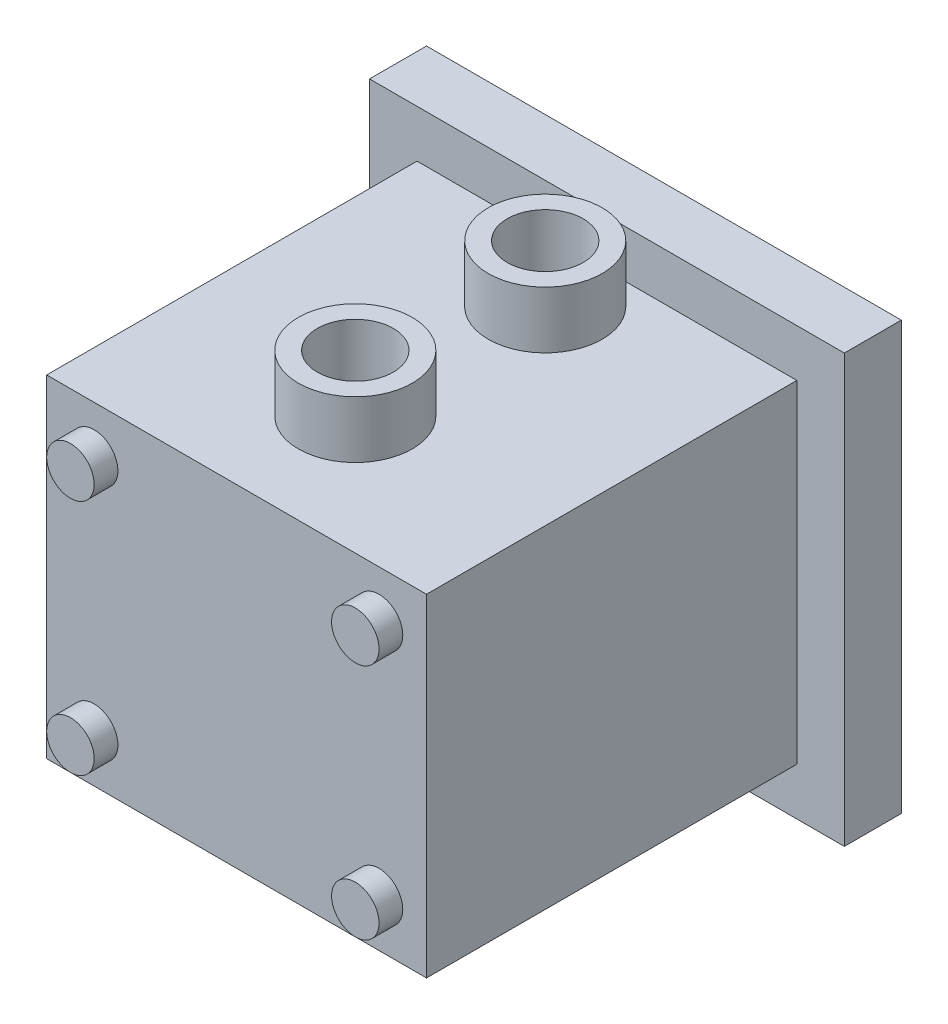
ISO-10303-21;
HEADER;
FILE_DESCRIPTION(('STEP AP214'),'2;1');
FILE_NAME('part.step','',(''),(''),'','','');
FILE_SCHEMA(('AUTOMOTIVE_DESIGN { 1 0 10303 214 1 1 1 1 }'));
ENDSEC;
DATA;
#1=APPLICATION_CONTEXT('core data for automotive mechanical design processes');
#2=APPLICATION_PROTOCOL_DEFINITION('international standard','automotive_design',2000,#1);
#3=PRODUCT_CONTEXT('',#1,'mechanical');
#4=PRODUCT('Part','Part','',(#3));
#5=PRODUCT_RELATED_PRODUCT_CATEGORY('part','',(#4));
#6=PRODUCT_DEFINITION_FORMATION('','',#4);
#7=PRODUCT_DEFINITION_CONTEXT('part definition',#1,'design');
#8=PRODUCT_DEFINITION('design','',#6,#7);
#9=PRODUCT_DEFINITION_SHAPE('','',#8);
#10=(LENGTH_UNIT() NAMED_UNIT(*) SI_UNIT(.MILLI.,.METRE.));
#11=(NAMED_UNIT(*) PLANE_ANGLE_UNIT() SI_UNIT($,.RADIAN.));
#12=(NAMED_UNIT(*) SI_UNIT($,.STERADIAN.) SOLID_ANGLE_UNIT());
#13=UNCERTAINTY_MEASURE_WITH_UNIT(LENGTH_MEASURE(1.E-05),#10,'distance_accuracy_value','');
#14=(GEOMETRIC_REPRESENTATION_CONTEXT(3) GLOBAL_UNCERTAINTY_ASSIGNED_CONTEXT((#13)) GLOBAL_UNIT_ASSIGNED_CONTEXT((#10,
#11,#12)) REPRESENTATION_CONTEXT('',''));
#15=CARTESIAN_POINT('',(0.,0.,0.));
#16=DIRECTION('',(0.,0.,1.));
#17=DIRECTION('',(1.,0.,0.));
#18=AXIS2_PLACEMENT_3D('',#15,#16,#17);
#19=CARTESIAN_POINT('',(0.,47.,65.));
#20=DIRECTION('',(0.,1.,0.));
#21=DIRECTION('',(0.,0.,1.));
#22=AXIS2_PLACEMENT_3D('',#19,#20,#21);
#23=PLANE('',#22);
#24=CARTESIAN_POINT('',(0.,47.,65.));
#25=DIRECTION('',(0.,1.,0.));
#26=DIRECTION('',(0.,0.,1.));
#27=AXIS2_PLACEMENT_3D('',#24,#25,#26);
#28=CIRCLE('',#27,12.);
#29=CARTESIAN_POINT('',(0.,47.,77.));
#30=VERTEX_POINT('',#29);
#31=EDGE_CURVE('E11',#30,#30,#28,.T.);
#32=ORIENTED_EDGE('',*,*,#31,.T.);
#33=EDGE_LOOP('',(#32));
#34=FACE_BOUND('',#33,.T.);
#35=CARTESIAN_POINT('',(0.,47.,65.));
#36=DIRECTION('',(0.,1.,0.));
#37=DIRECTION('',(0.,0.,1.));
#38=AXIS2_PLACEMENT_3D('',#35,#36,#37);
#39=CIRCLE('',#38,8.);
#40=CARTESIAN_POINT('',(0.,47.,73.));
#41=VERTEX_POINT('',#40);
#42=EDGE_CURVE('E67',#41,#41,#39,.T.);
#43=ORIENTED_EDGE('',*,*,#42,.F.);
#44=EDGE_LOOP('',(#43));
#45=FACE_BOUND('',#44,.T.);
#46=ADVANCED_FACE('F53',(#34,#45),#23,.T.);
#47=CARTESIAN_POINT('',(0.,35.,65.));
#48=DIRECTION('',(0.,1.,0.));
#49=DIRECTION('',(0.,0.,1.));
#50=AXIS2_PLACEMENT_3D('',#47,#48,#49);
#51=PLANE('',#50);
#52=CARTESIAN_POINT('',(0.,35.,65.));
#53=DIRECTION('',(0.,1.,0.));
#54=DIRECTION('',(0.,0.,1.));
#55=AXIS2_PLACEMENT_3D('',#52,#53,#54);
#56=CIRCLE('',#55,12.);
#57=CARTESIAN_POINT('',(0.,35.,77.));
#58=VERTEX_POINT('',#57);
#59=EDGE_CURVE('E59',#58,#58,#56,.T.);
#60=ORIENTED_EDGE('',*,*,#59,.F.);
#61=EDGE_LOOP('',(#60));
#62=FACE_BOUND('',#61,.T.);
#63=CARTESIAN_POINT('',(0.,35.,65.));
#64=DIRECTION('',(0.,1.,0.));
#65=DIRECTION('',(0.,0.,1.));
#66=AXIS2_PLACEMENT_3D('',#63,#64,#65);
#67=CIRCLE('',#66,8.);
#68=CARTESIAN_POINT('',(0.,35.,73.));
#69=VERTEX_POINT('',#68);
#70=EDGE_CURVE('E69',#69,#69,#67,.T.);
#71=ORIENTED_EDGE('',*,*,#70,.T.);
#72=EDGE_LOOP('',(#71));
#73=FACE_BOUND('',#72,.T.);
#74=ADVANCED_FACE('F84',(#62,#73),#51,.F.);
#75=CARTESIAN_POINT('',(0.,47.,65.));
#76=DIRECTION('',(0.,-1.,0.));
#77=DIRECTION('',(0.,0.,-1.));
#78=AXIS2_PLACEMENT_3D('',#75,#76,#77);
#79=CYLINDRICAL_SURFACE('',#78,12.);
#80=ORIENTED_EDGE('',*,*,#31,.F.);
#81=EDGE_LOOP('',(#80));
#82=FACE_BOUND('',#81,.T.);
#83=ORIENTED_EDGE('',*,*,#59,.T.);
#84=EDGE_LOOP('',(#83));
#85=FACE_BOUND('',#84,.T.);
#86=ADVANCED_FACE('F57',(#82,#85),#79,.T.);
#87=CARTESIAN_POINT('',(0.,47.,65.));
#88=DIRECTION('',(0.,-1.,0.));
#89=DIRECTION('',(0.,0.,-1.));
#90=AXIS2_PLACEMENT_3D('',#87,#88,#89);
#91=CYLINDRICAL_SURFACE('',#90,8.);
#92=ORIENTED_EDGE('',*,*,#42,.T.);
#93=EDGE_LOOP('',(#92));
#94=FACE_BOUND('',#93,.T.);
#95=ORIENTED_EDGE('',*,*,#70,.F.);
#96=EDGE_LOOP('',(#95));
#97=FACE_BOUND('',#96,.T.);
#98=ADVANCED_FACE('F80',(#94,#97),#91,.F.);
#99=CLOSED_SHELL('',(#46,#74,#86,#98));
#100=MANIFOLD_SOLID_BREP('B2',#99);
#101=CARTESIAN_POINT('',(0.,47.,25.));
#102=DIRECTION('',(0.,1.,0.));
#103=DIRECTION('',(0.,0.,1.));
#104=AXIS2_PLACEMENT_3D('',#101,#102,#103);
#105=PLANE('',#104);
#106=CARTESIAN_POINT('',(0.,47.,25.));
#107=DIRECTION('',(0.,1.,0.));
#108=DIRECTION('',(0.,0.,1.));
#109=AXIS2_PLACEMENT_3D('',#106,#107,#108);
#110=CIRCLE('',#109,12.);
#111=CARTESIAN_POINT('',(0.,47.,37.));
#112=VERTEX_POINT('',#111);
#113=EDGE_CURVE('E52',#112,#112,#110,.T.);
#114=ORIENTED_EDGE('',*,*,#113,.T.);
#115=EDGE_LOOP('',(#114));
#116=FACE_BOUND('',#115,.T.);
#117=CARTESIAN_POINT('',(0.,47.,25.));
#118=DIRECTION('',(0.,1.,0.));
#119=DIRECTION('',(0.,0.,1.));
#120=AXIS2_PLACEMENT_3D('',#117,#118,#119);
#121=CIRCLE('',#120,8.);
#122=CARTESIAN_POINT('',(0.,47.,33.));
#123=VERTEX_POINT('',#122);
#124=EDGE_CURVE('E149',#123,#123,#121,.T.);
#125=ORIENTED_EDGE('',*,*,#124,.F.);
#126=EDGE_LOOP('',(#125));
#127=FACE_BOUND('',#126,.T.);
#128=ADVANCED_FACE('F135',(#116,#127),#105,.T.);
#129=CARTESIAN_POINT('',(0.,35.,25.));
#130=DIRECTION('',(0.,1.,0.));
#131=DIRECTION('',(0.,0.,1.));
#132=AXIS2_PLACEMENT_3D('',#129,#130,#131);
#133=PLANE('',#132);
#134=CARTESIAN_POINT('',(0.,35.,25.));
#135=DIRECTION('',(0.,1.,0.));
#136=DIRECTION('',(0.,0.,1.));
#137=AXIS2_PLACEMENT_3D('',#134,#135,#136);
#138=CIRCLE('',#137,12.);
#139=CARTESIAN_POINT('',(0.,35.,37.));
#140=VERTEX_POINT('',#139);
#141=EDGE_CURVE('E137',#140,#140,#138,.T.);
#142=ORIENTED_EDGE('',*,*,#141,.F.);
#143=EDGE_LOOP('',(#142));
#144=FACE_BOUND('',#143,.T.);
#145=CARTESIAN_POINT('',(0.,35.,25.));
#146=DIRECTION('',(0.,1.,0.));
#147=DIRECTION('',(0.,0.,1.));
#148=AXIS2_PLACEMENT_3D('',#145,#146,#147);
#149=CIRCLE('',#148,8.);
#150=CARTESIAN_POINT('',(0.,35.,33.));
#151=VERTEX_POINT('',#150);
#152=EDGE_CURVE('E150',#151,#151,#149,.T.);
#153=ORIENTED_EDGE('',*,*,#152,.T.);
#154=EDGE_LOOP('',(#153));
#155=FACE_BOUND('',#154,.T.);
#156=ADVANCED_FACE('F156',(#144,#155),#133,.F.);
#157=CARTESIAN_POINT('',(0.,47.,25.));
#158=DIRECTION('',(0.,-1.,0.));
#159=DIRECTION('',(0.,0.,-1.));
#160=AXIS2_PLACEMENT_3D('',#157,#158,#159);
#161=CYLINDRICAL_SURFACE('',#160,12.);
#162=ORIENTED_EDGE('',*,*,#113,.F.);
#163=EDGE_LOOP('',(#162));
#164=FACE_BOUND('',#163,.T.);
#165=ORIENTED_EDGE('',*,*,#141,.T.);
#166=EDGE_LOOP('',(#165));
#167=FACE_BOUND('',#166,.T.);
#168=ADVANCED_FACE('F133',(#164,#167),#161,.T.);
#169=CARTESIAN_POINT('',(0.,47.,25.));
#170=DIRECTION('',(0.,-1.,0.));
#171=DIRECTION('',(0.,0.,-1.));
#172=AXIS2_PLACEMENT_3D('',#169,#170,#171);
#173=CYLINDRICAL_SURFACE('',#172,8.);
#174=ORIENTED_EDGE('',*,*,#124,.T.);
#175=EDGE_LOOP('',(#174));
#176=FACE_BOUND('',#175,.T.);
#177=ORIENTED_EDGE('',*,*,#152,.F.);
#178=EDGE_LOOP('',(#177));
#179=FACE_BOUND('',#178,.T.);
#180=ADVANCED_FACE('F154',(#176,#179),#173,.F.);
#181=CLOSED_SHELL('',(#128,#156,#168,#180));
#182=MANIFOLD_SOLID_BREP('B6',#181);
#183=CARTESIAN_POINT('',(30.,25.,95.));
#184=DIRECTION('',(0.,0.,-1.));
#185=DIRECTION('',(-1.,0.,0.));
#186=AXIS2_PLACEMENT_3D('',#183,#184,#185);
#187=CYLINDRICAL_SURFACE('',#186,5.);
#188=CARTESIAN_POINT('',(30.,25.,95.));
#189=DIRECTION('',(0.,0.,1.));
#190=DIRECTION('',(1.,0.,0.));
#191=AXIS2_PLACEMENT_3D('',#188,#189,#190);
#192=CIRCLE('',#191,5.);
#193=CARTESIAN_POINT('',(35.,25.,95.));
#194=VERTEX_POINT('',#193);
#195=EDGE_CURVE('E131',#194,#194,#192,.T.);
#196=ORIENTED_EDGE('',*,*,#195,.F.);
#197=EDGE_LOOP('',(#196));
#198=FACE_BOUND('',#197,.T.);
#199=CARTESIAN_POINT('',(30.,25.,90.));
#200=DIRECTION('',(0.,0.,1.));
#201=DIRECTION('',(1.,0.,0.));
#202=AXIS2_PLACEMENT_3D('',#199,#200,#201);
#203=CIRCLE('',#202,5.);
#204=CARTESIAN_POINT('',(35.,25.,90.));
#205=VERTEX_POINT('',#204);
#206=EDGE_CURVE('E215',#205,#205,#203,.T.);
#207=ORIENTED_EDGE('',*,*,#206,.T.);
#208=EDGE_LOOP('',(#207));
#209=FACE_BOUND('',#208,.T.);
#210=ADVANCED_FACE('F208',(#198,#209),#187,.T.);
#211=CARTESIAN_POINT('',(30.,25.,95.));
#212=DIRECTION('',(0.,0.,1.));
#213=DIRECTION('',(1.,0.,0.));
#214=AXIS2_PLACEMENT_3D('',#211,#212,#213);
#215=PLANE('',#214);
#216=ORIENTED_EDGE('',*,*,#195,.T.);
#217=EDGE_LOOP('',(#216));
#218=FACE_BOUND('',#217,.T.);
#219=ADVANCED_FACE('F227',(#218),#215,.T.);
#220=CARTESIAN_POINT('',(30.,25.,90.));
#221=DIRECTION('',(0.,0.,1.));
#222=DIRECTION('',(1.,0.,0.));
#223=AXIS2_PLACEMENT_3D('',#220,#221,#222);
#224=PLANE('',#223);
#225=ORIENTED_EDGE('',*,*,#206,.F.);
#226=EDGE_LOOP('',(#225));
#227=FACE_BOUND('',#226,.T.);
#228=ADVANCED_FACE('F223',(#227),#224,.F.);
#229=CLOSED_SHELL('',(#210,#219,#228));
#230=MANIFOLD_SOLID_BREP('B48',#229);
#231=CARTESIAN_POINT('',(30.,-25.,95.));
#232=DIRECTION('',(0.,0.,-1.));
#233=DIRECTION('',(-1.,0.,0.));
#234=AXIS2_PLACEMENT_3D('',#231,#232,#233);
#235=CYLINDRICAL_SURFACE('',#234,5.);
#236=CARTESIAN_POINT('',(30.,-25.,95.));
#237=DIRECTION('',(0.,0.,1.));
#238=DIRECTION('',(1.,0.,0.));
#239=AXIS2_PLACEMENT_3D('',#236,#237,#238);
#240=CIRCLE('',#239,5.);
#241=CARTESIAN_POINT('',(35.,-25.,95.));
#242=VERTEX_POINT('',#241);
#243=EDGE_CURVE('E209',#242,#242,#240,.T.);
#244=ORIENTED_EDGE('',*,*,#243,.F.);
#245=EDGE_LOOP('',(#244));
#246=FACE_BOUND('',#245,.T.);
#247=CARTESIAN_POINT('',(30.,-25.,90.));
#248=DIRECTION('',(0.,0.,1.));
#249=DIRECTION('',(1.,0.,0.));
#250=AXIS2_PLACEMENT_3D('',#247,#248,#249);
#251=CIRCLE('',#250,5.);
#252=CARTESIAN_POINT('',(35.,-25.,90.));
#253=VERTEX_POINT('',#252);
#254=EDGE_CURVE('E269',#253,#253,#251,.T.);
#255=ORIENTED_EDGE('',*,*,#254,.T.);
#256=EDGE_LOOP('',(#255));
#257=FACE_BOUND('',#256,.T.);
#258=ADVANCED_FACE('F263',(#246,#257),#235,.T.);
#259=CARTESIAN_POINT('',(30.,-25.,95.));
#260=DIRECTION('',(0.,0.,1.));
#261=DIRECTION('',(1.,0.,0.));
#262=AXIS2_PLACEMENT_3D('',#259,#260,#261);
#263=PLANE('',#262);
#264=ORIENTED_EDGE('',*,*,#243,.T.);
#265=EDGE_LOOP('',(#264));
#266=FACE_BOUND('',#265,.T.);
#267=ADVANCED_FACE('F281',(#266),#263,.T.);
#268=CARTESIAN_POINT('',(30.,-25.,90.));
#269=DIRECTION('',(0.,0.,1.));
#270=DIRECTION('',(1.,0.,0.));
#271=AXIS2_PLACEMENT_3D('',#268,#269,#270);
#272=PLANE('',#271);
#273=ORIENTED_EDGE('',*,*,#254,.F.);
#274=EDGE_LOOP('',(#273));
#275=FACE_BOUND('',#274,.T.);
#276=ADVANCED_FACE('F278',(#275),#272,.F.);
#277=CLOSED_SHELL('',(#258,#267,#276));
#278=MANIFOLD_SOLID_BREP('B129',#277);
#279=CARTESIAN_POINT('',(-30.,25.,95.));
#280=DIRECTION('',(0.,0.,-1.));
#281=DIRECTION('',(-1.,0.,0.));
#282=AXIS2_PLACEMENT_3D('',#279,#280,#281);
#283=CYLINDRICAL_SURFACE('',#282,5.);
#284=CARTESIAN_POINT('',(-30.,25.,95.));
#285=DIRECTION('',(0.,0.,1.));
#286=DIRECTION('',(1.,0.,0.));
#287=AXIS2_PLACEMENT_3D('',#284,#285,#286);
#288=CIRCLE('',#287,5.);
#289=CARTESIAN_POINT('',(-25.,25.,95.));
#290=VERTEX_POINT('',#289);
#291=EDGE_CURVE('E262',#290,#290,#288,.T.);
#292=ORIENTED_EDGE('',*,*,#291,.F.);
#293=EDGE_LOOP('',(#292));
#294=FACE_BOUND('',#293,.T.);
#295=CARTESIAN_POINT('',(-30.,25.,90.));
#296=DIRECTION('',(0.,0.,1.));
#297=DIRECTION('',(1.,0.,0.));
#298=AXIS2_PLACEMENT_3D('',#295,#296,#297);
#299=CIRCLE('',#298,5.);
#300=CARTESIAN_POINT('',(-25.,25.,90.));
#301=VERTEX_POINT('',#300);
#302=EDGE_CURVE('E324',#301,#301,#299,.T.);
#303=ORIENTED_EDGE('',*,*,#302,.T.);
#304=EDGE_LOOP('',(#303));
#305=FACE_BOUND('',#304,.T.);
#306=ADVANCED_FACE('F319',(#294,#305),#283,.T.);
#307=CARTESIAN_POINT('',(-30.,25.,95.));
#308=DIRECTION('',(0.,0.,1.));
#309=DIRECTION('',(1.,0.,0.));
#310=AXIS2_PLACEMENT_3D('',#307,#308,#309);
#311=PLANE('',#310);
#312=ORIENTED_EDGE('',*,*,#291,.T.);
#313=EDGE_LOOP('',(#312));
#314=FACE_BOUND('',#313,.T.);
#315=ADVANCED_FACE('F333',(#314),#311,.T.);
#316=CARTESIAN_POINT('',(-30.,25.,90.));
#317=DIRECTION('',(0.,0.,1.));
#318=DIRECTION('',(1.,0.,0.));
#319=AXIS2_PLACEMENT_3D('',#316,#317,#318);
#320=PLANE('',#319);
#321=ORIENTED_EDGE('',*,*,#302,.F.);
#322=EDGE_LOOP('',(#321));
#323=FACE_BOUND('',#322,.T.);
#324=ADVANCED_FACE('F335',(#323),#320,.F.);
#325=CLOSED_SHELL('',(#306,#315,#324));
#326=MANIFOLD_SOLID_BREP('B201',#325);
#327=CARTESIAN_POINT('',(-30.,-25.,95.));
#328=DIRECTION('',(0.,0.,-1.));
#329=DIRECTION('',(-1.,0.,0.));
#330=AXIS2_PLACEMENT_3D('',#327,#328,#329);
#331=CYLINDRICAL_SURFACE('',#330,5.);
#332=CARTESIAN_POINT('',(-30.,-25.,95.));
#333=DIRECTION('',(0.,0.,1.));
#334=DIRECTION('',(1.,0.,0.));
#335=AXIS2_PLACEMENT_3D('',#332,#333,#334);
#336=CIRCLE('',#335,5.);
#337=CARTESIAN_POINT('',(-25.,-25.,95.));
#338=VERTEX_POINT('',#337);
#339=EDGE_CURVE('E320',#338,#338,#336,.T.);
#340=ORIENTED_EDGE('',*,*,#339,.F.);
#341=EDGE_LOOP('',(#340));
#342=FACE_BOUND('',#341,.T.);
#343=CARTESIAN_POINT('',(-30.,-25.,90.));
#344=DIRECTION('',(0.,0.,1.));
#345=DIRECTION('',(1.,0.,0.));
#346=AXIS2_PLACEMENT_3D('',#343,#344,#345);
#347=CIRCLE('',#346,5.);
#348=CARTESIAN_POINT('',(-25.,-25.,90.));
#349=VERTEX_POINT('',#348);
#350=EDGE_CURVE('E374',#349,#349,#347,.T.);
#351=ORIENTED_EDGE('',*,*,#350,.T.);
#352=EDGE_LOOP('',(#351));
#353=FACE_BOUND('',#352,.T.);
#354=ADVANCED_FACE('F375',(#342,#353),#331,.T.);
#355=CARTESIAN_POINT('',(-30.,-25.,95.));
#356=DIRECTION('',(0.,0.,1.));
#357=DIRECTION('',(1.,0.,0.));
#358=AXIS2_PLACEMENT_3D('',#355,#356,#357);
#359=PLANE('',#358);
#360=ORIENTED_EDGE('',*,*,#339,.T.);
#361=EDGE_LOOP('',(#360));
#362=FACE_BOUND('',#361,.T.);
#363=ADVANCED_FACE('F388',(#362),#359,.T.);
#364=CARTESIAN_POINT('',(-30.,-25.,90.));
#365=DIRECTION('',(0.,0.,1.));
#366=DIRECTION('',(1.,0.,0.));
#367=AXIS2_PLACEMENT_3D('',#364,#365,#366);
#368=PLANE('',#367);
#369=ORIENTED_EDGE('',*,*,#350,.F.);
#370=EDGE_LOOP('',(#369));
#371=FACE_BOUND('',#370,.T.);
#372=ADVANCED_FACE('F386',(#371),#368,.F.);
#373=CLOSED_SHELL('',(#354,#363,#372));
#374=MANIFOLD_SOLID_BREP('B260',#373);
#375=CARTESIAN_POINT('',(0.,0.,-30.));
#376=DIRECTION('',(0.,0.,1.));
#377=DIRECTION('',(1.,0.,0.));
#378=AXIS2_PLACEMENT_3D('',#375,#376,#377);
#379=CYLINDRICAL_SURFACE('',#378,9.525);
#380=CARTESIAN_POINT('',(0.,0.,-30.));
#381=DIRECTION('',(0.,0.,1.));
#382=DIRECTION('',(1.,0.,0.));
#383=AXIS2_PLACEMENT_3D('',#380,#381,#382);
#384=CIRCLE('',#383,9.525);
#385=CARTESIAN_POINT('',(9.525,0.,-30.));
#386=VERTEX_POINT('',#385);
#387=EDGE_CURVE('E371',#386,#386,#384,.T.);
#388=ORIENTED_EDGE('',*,*,#387,.T.);
#389=EDGE_LOOP('',(#388));
#390=FACE_BOUND('',#389,.T.);
#391=CARTESIAN_POINT('',(0.,0.,0.));
#392=DIRECTION('',(0.,0.,1.));
#393=DIRECTION('',(1.,0.,0.));
#394=AXIS2_PLACEMENT_3D('',#391,#392,#393);
#395=CIRCLE('',#394,9.525);
#396=CARTESIAN_POINT('',(9.525,0.,0.));
#397=VERTEX_POINT('',#396);
#398=EDGE_CURVE('E431',#397,#397,#395,.T.);
#399=ORIENTED_EDGE('',*,*,#398,.F.);
#400=EDGE_LOOP('',(#399));
#401=FACE_BOUND('',#400,.T.);
#402=ADVANCED_FACE('F426',(#390,#401),#379,.T.);
#403=CARTESIAN_POINT('',(0.,0.,-30.));
#404=DIRECTION('',(0.,0.,1.));
#405=DIRECTION('',(1.,0.,0.));
#406=AXIS2_PLACEMENT_3D('',#403,#404,#405);
#407=PLANE('',#406);
#408=ORIENTED_EDGE('',*,*,#387,.F.);
#409=EDGE_LOOP('',(#408));
#410=FACE_BOUND('',#409,.T.);
#411=ADVANCED_FACE('F444',(#410),#407,.F.);
#412=CARTESIAN_POINT('',(0.,0.,0.));
#413=DIRECTION('',(0.,0.,1.));
#414=DIRECTION('',(1.,0.,0.));
#415=AXIS2_PLACEMENT_3D('',#412,#413,#414);
#416=PLANE('',#415);
#417=ORIENTED_EDGE('',*,*,#398,.T.);
#418=EDGE_LOOP('',(#417));
#419=FACE_BOUND('',#418,.T.);
#420=ADVANCED_FACE('F445',(#419),#416,.T.);
#421=CLOSED_SHELL('',(#402,#411,#420));
#422=MANIFOLD_SOLID_BREP('B315',#421);
#423=CARTESIAN_POINT('',(-50.,-45.,12.));
#424=DIRECTION('',(1.,0.,0.));
#425=DIRECTION('',(0.,0.,-1.));
#426=AXIS2_PLACEMENT_3D('',#423,#424,#425);
#427=PLANE('',#426);
#428=DIRECTION('',(0.,-1.,0.));
#429=VECTOR('',#428,1.);
#430=CARTESIAN_POINT('',(-50.,-45.,0.));
#431=LINE('',#430,#429);
#432=CARTESIAN_POINT('',(-50.,45.,0.));
#433=VERTEX_POINT('',#432);
#434=CARTESIAN_POINT('',(-50.,-45.,0.));
#435=VERTEX_POINT('',#434);
#436=EDGE_CURVE('E552',#433,#435,#431,.T.);
#437=ORIENTED_EDGE('',*,*,#436,.T.);
#438=DIRECTION('',(0.,0.,-1.));
#439=VECTOR('',#438,1.);
#440=CARTESIAN_POINT('',(-50.,-45.,12.));
#441=LINE('',#440,#439);
#442=CARTESIAN_POINT('',(-50.,-45.,12.));
#443=VERTEX_POINT('',#442);
#444=EDGE_CURVE('E428',#443,#435,#441,.T.);
#445=ORIENTED_EDGE('',*,*,#444,.F.);
#446=DIRECTION('',(0.,-1.,0.));
#447=VECTOR('',#446,1.);
#448=CARTESIAN_POINT('',(-50.,-45.,12.));
#449=LINE('',#448,#447);
#450=CARTESIAN_POINT('',(-50.,45.,12.));
#451=VERTEX_POINT('',#450);
#452=EDGE_CURVE('E533',#451,#443,#449,.T.);
#453=ORIENTED_EDGE('',*,*,#452,.F.);
#454=DIRECTION('',(0.,0.,-1.));
#455=VECTOR('',#454,1.);
#456=CARTESIAN_POINT('',(-50.,45.,12.));
#457=LINE('',#456,#455);
#458=EDGE_CURVE('E550',#451,#433,#457,.T.);
#459=ORIENTED_EDGE('',*,*,#458,.T.);
#460=EDGE_LOOP('',(#437,#445,#453,#459));
#461=FACE_BOUND('',#460,.T.);
#462=ADVANCED_FACE('F485',(#461),#427,.F.);
#463=CARTESIAN_POINT('',(-50.,-45.,12.));
#464=DIRECTION('',(0.,1.,0.));
#465=DIRECTION('',(0.,0.,1.));
#466=AXIS2_PLACEMENT_3D('',#463,#464,#465);
#467=PLANE('',#466);
#468=DIRECTION('',(1.,0.,0.));
#469=VECTOR('',#468,1.);
#470=CARTESIAN_POINT('',(-50.,-45.,0.));
#471=LINE('',#470,#469);
#472=CARTESIAN_POINT('',(50.,-45.,0.));
#473=VERTEX_POINT('',#472);
#474=EDGE_CURVE('E537',#435,#473,#471,.T.);
#475=ORIENTED_EDGE('',*,*,#474,.T.);
#476=DIRECTION('',(0.,0.,-1.));
#477=VECTOR('',#476,1.);
#478=CARTESIAN_POINT('',(50.,-45.,12.));
#479=LINE('',#478,#477);
#480=CARTESIAN_POINT('',(50.,-45.,12.));
#481=VERTEX_POINT('',#480);
#482=EDGE_CURVE('E495',#481,#473,#479,.T.);
#483=ORIENTED_EDGE('',*,*,#482,.F.);
#484=DIRECTION('',(1.,0.,0.));
#485=VECTOR('',#484,1.);
#486=CARTESIAN_POINT('',(-50.,-45.,12.));
#487=LINE('',#486,#485);
#488=EDGE_CURVE('E528',#443,#481,#487,.T.);
#489=ORIENTED_EDGE('',*,*,#488,.F.);
#490=ORIENTED_EDGE('',*,*,#444,.T.);
#491=EDGE_LOOP('',(#475,#483,#489,#490));
#492=FACE_BOUND('',#491,.T.);
#493=ADVANCED_FACE('F538',(#492),#467,.F.);
#494=CARTESIAN_POINT('',(50.,-45.,12.));
#495=DIRECTION('',(-1.,0.,0.));
#496=DIRECTION('',(0.,0.,1.));
#497=AXIS2_PLACEMENT_3D('',#494,#495,#496);
#498=PLANE('',#497);
#499=DIRECTION('',(0.,1.,0.));
#500=VECTOR('',#499,1.);
#501=CARTESIAN_POINT('',(50.,-45.,0.));
#502=LINE('',#501,#500);
#503=CARTESIAN_POINT('',(50.,45.,0.));
#504=VERTEX_POINT('',#503);
#505=EDGE_CURVE('E516',#473,#504,#502,.T.);
#506=ORIENTED_EDGE('',*,*,#505,.T.);
#507=DIRECTION('',(0.,0.,-1.));
#508=VECTOR('',#507,1.);
#509=CARTESIAN_POINT('',(50.,45.,12.));
#510=LINE('',#509,#508);
#511=CARTESIAN_POINT('',(50.,45.,12.));
#512=VERTEX_POINT('',#511);
#513=EDGE_CURVE('E545',#512,#504,#510,.T.);
#514=ORIENTED_EDGE('',*,*,#513,.F.);
#515=DIRECTION('',(0.,1.,0.));
#516=VECTOR('',#515,1.);
#517=CARTESIAN_POINT('',(50.,-45.,12.));
#518=LINE('',#517,#516);
#519=EDGE_CURVE('E531',#481,#512,#518,.T.);
#520=ORIENTED_EDGE('',*,*,#519,.F.);
#521=ORIENTED_EDGE('',*,*,#482,.T.);
#522=EDGE_LOOP('',(#506,#514,#520,#521));
#523=FACE_BOUND('',#522,.T.);
#524=ADVANCED_FACE('F542',(#523),#498,.F.);
#525=CARTESIAN_POINT('',(-50.,45.,12.));
#526=DIRECTION('',(0.,-1.,0.));
#527=DIRECTION('',(0.,0.,-1.));
#528=AXIS2_PLACEMENT_3D('',#525,#526,#527);
#529=PLANE('',#528);
#530=DIRECTION('',(-1.,0.,0.));
#531=VECTOR('',#530,1.);
#532=CARTESIAN_POINT('',(-50.,45.,0.));
#533=LINE('',#532,#531);
#534=EDGE_CURVE('E522',#504,#433,#533,.T.);
#535=ORIENTED_EDGE('',*,*,#534,.T.);
#536=ORIENTED_EDGE('',*,*,#458,.F.);
#537=DIRECTION('',(-1.,0.,0.));
#538=VECTOR('',#537,1.);
#539=CARTESIAN_POINT('',(-50.,45.,12.));
#540=LINE('',#539,#538);
#541=EDGE_CURVE('E499',#512,#451,#540,.T.);
#542=ORIENTED_EDGE('',*,*,#541,.F.);
#543=ORIENTED_EDGE('',*,*,#513,.T.);
#544=EDGE_LOOP('',(#535,#536,#542,#543));
#545=FACE_BOUND('',#544,.T.);
#546=ADVANCED_FACE('F562',(#545),#529,.F.);
#547=CARTESIAN_POINT('',(0.,0.,12.));
#548=DIRECTION('',(0.,0.,-1.));
#549=DIRECTION('',(-1.,0.,0.));
#550=AXIS2_PLACEMENT_3D('',#547,#548,#549);
#551=PLANE('',#550);
#552=ORIENTED_EDGE('',*,*,#452,.T.);
#553=ORIENTED_EDGE('',*,*,#488,.T.);
#554=ORIENTED_EDGE('',*,*,#519,.T.);
#555=ORIENTED_EDGE('',*,*,#541,.T.);
#556=EDGE_LOOP('',(#552,#553,#554,#555));
#557=FACE_BOUND('',#556,.T.);
#558=ADVANCED_FACE('F532',(#557),#551,.F.);
#559=CARTESIAN_POINT('',(0.,0.,0.));
#560=DIRECTION('',(0.,0.,-1.));
#561=DIRECTION('',(-1.,0.,0.));
#562=AXIS2_PLACEMENT_3D('',#559,#560,#561);
#563=PLANE('',#562);
#564=ORIENTED_EDGE('',*,*,#436,.F.);
#565=ORIENTED_EDGE('',*,*,#534,.F.);
#566=ORIENTED_EDGE('',*,*,#505,.F.);
#567=ORIENTED_EDGE('',*,*,#474,.F.);
#568=EDGE_LOOP('',(#564,#565,#566,#567));
#569=FACE_BOUND('',#568,.T.);
#570=ADVANCED_FACE('F570',(#569),#563,.T.);
#571=CLOSED_SHELL('',(#462,#493,#524,#546,#558,#570));
#572=MANIFOLD_SOLID_BREP('B366',#571);
#573=CARTESIAN_POINT('',(-40.,-35.,90.));
#574=DIRECTION('',(1.,0.,0.));
#575=DIRECTION('',(0.,0.,-1.));
#576=AXIS2_PLACEMENT_3D('',#573,#574,#575);
#577=PLANE('',#576);
#578=DIRECTION('',(0.,-1.,0.));
#579=VECTOR('',#578,1.);
#580=CARTESIAN_POINT('',(-40.,-35.,12.));
#581=LINE('',#580,#579);
#582=CARTESIAN_POINT('',(-40.,35.,12.));
#583=VERTEX_POINT('',#582);
#584=CARTESIAN_POINT('',(-40.,-35.,12.));
#585=VERTEX_POINT('',#584);
#586=EDGE_CURVE('E694',#583,#585,#581,.T.);
#587=ORIENTED_EDGE('',*,*,#586,.T.);
#588=DIRECTION('',(0.,0.,-1.));
#589=VECTOR('',#588,1.);
#590=CARTESIAN_POINT('',(-40.,-35.,90.));
#591=LINE('',#590,#589);
#592=CARTESIAN_POINT('',(-40.,-35.,90.));
#593=VERTEX_POINT('',#592);
#594=EDGE_CURVE('E482',#593,#585,#591,.T.);
#595=ORIENTED_EDGE('',*,*,#594,.F.);
#596=DIRECTION('',(0.,-1.,0.));
#597=VECTOR('',#596,1.);
#598=CARTESIAN_POINT('',(-40.,-35.,90.));
#599=LINE('',#598,#597);
#600=CARTESIAN_POINT('',(-40.,35.,90.));
#601=VERTEX_POINT('',#600);
#602=EDGE_CURVE('E679',#601,#593,#599,.T.);
#603=ORIENTED_EDGE('',*,*,#602,.F.);
#604=DIRECTION('',(0.,0.,-1.));
#605=VECTOR('',#604,1.);
#606=CARTESIAN_POINT('',(-40.,35.,90.));
#607=LINE('',#606,#605);
#608=EDGE_CURVE('E691',#601,#583,#607,.T.);
#609=ORIENTED_EDGE('',*,*,#608,.T.);
#610=EDGE_LOOP('',(#587,#595,#603,#609));
#611=FACE_BOUND('',#610,.T.);
#612=ADVANCED_FACE('F622',(#611),#577,.F.);
#613=CARTESIAN_POINT('',(-40.,-35.,90.));
#614=DIRECTION('',(0.,1.,0.));
#615=DIRECTION('',(0.,0.,1.));
#616=AXIS2_PLACEMENT_3D('',#613,#614,#615);
#617=PLANE('',#616);
#618=DIRECTION('',(1.,0.,0.));
#619=VECTOR('',#618,1.);
#620=CARTESIAN_POINT('',(-40.,-35.,12.));
#621=LINE('',#620,#619);
#622=CARTESIAN_POINT('',(40.,-35.,12.));
#623=VERTEX_POINT('',#622);
#624=EDGE_CURVE('E682',#585,#623,#621,.T.);
#625=ORIENTED_EDGE('',*,*,#624,.T.);
#626=DIRECTION('',(0.,0.,-1.));
#627=VECTOR('',#626,1.);
#628=CARTESIAN_POINT('',(40.,-35.,90.));
#629=LINE('',#628,#627);
#630=CARTESIAN_POINT('',(40.,-35.,90.));
#631=VERTEX_POINT('',#630);
#632=EDGE_CURVE('E632',#631,#623,#629,.T.);
#633=ORIENTED_EDGE('',*,*,#632,.F.);
#634=DIRECTION('',(1.,0.,0.));
#635=VECTOR('',#634,1.);
#636=CARTESIAN_POINT('',(-40.,-35.,90.));
#637=LINE('',#636,#635);
#638=EDGE_CURVE('E675',#593,#631,#637,.T.);
#639=ORIENTED_EDGE('',*,*,#638,.F.);
#640=ORIENTED_EDGE('',*,*,#594,.T.);
#641=EDGE_LOOP('',(#625,#633,#639,#640));
#642=FACE_BOUND('',#641,.T.);
#643=ADVANCED_FACE('F683',(#642),#617,.F.);
#644=CARTESIAN_POINT('',(40.,-35.,90.));
#645=DIRECTION('',(-1.,0.,0.));
#646=DIRECTION('',(0.,0.,1.));
#647=AXIS2_PLACEMENT_3D('',#644,#645,#646);
#648=PLANE('',#647);
#649=DIRECTION('',(0.,1.,0.));
#650=VECTOR('',#649,1.);
#651=CARTESIAN_POINT('',(40.,-35.,12.));
#652=LINE('',#651,#650);
#653=CARTESIAN_POINT('',(40.,35.,12.));
#654=VERTEX_POINT('',#653);
#655=EDGE_CURVE('E656',#623,#654,#652,.T.);
#656=ORIENTED_EDGE('',*,*,#655,.T.);
#657=DIRECTION('',(0.,0.,-1.));
#658=VECTOR('',#657,1.);
#659=CARTESIAN_POINT('',(40.,35.,90.));
#660=LINE('',#659,#658);
#661=CARTESIAN_POINT('',(40.,35.,90.));
#662=VERTEX_POINT('',#661);
#663=EDGE_CURVE('E685',#662,#654,#660,.T.);
#664=ORIENTED_EDGE('',*,*,#663,.F.);
#665=DIRECTION('',(0.,1.,0.));
#666=VECTOR('',#665,1.);
#667=CARTESIAN_POINT('',(40.,-35.,90.));
#668=LINE('',#667,#666);
#669=EDGE_CURVE('E674',#631,#662,#668,.T.);
#670=ORIENTED_EDGE('',*,*,#669,.F.);
#671=ORIENTED_EDGE('',*,*,#632,.T.);
#672=EDGE_LOOP('',(#656,#664,#670,#671));
#673=FACE_BOUND('',#672,.T.);
#674=ADVANCED_FACE('F684',(#673),#648,.F.);
#675=CARTESIAN_POINT('',(-40.,35.,90.));
#676=DIRECTION('',(0.,-1.,0.));
#677=DIRECTION('',(0.,0.,-1.));
#678=AXIS2_PLACEMENT_3D('',#675,#676,#677);
#679=PLANE('',#678);
#680=DIRECTION('',(-1.,0.,0.));
#681=VECTOR('',#680,1.);
#682=CARTESIAN_POINT('',(-40.,35.,12.));
#683=LINE('',#682,#681);
#684=EDGE_CURVE('E663',#654,#583,#683,.T.);
#685=ORIENTED_EDGE('',*,*,#684,.T.);
#686=ORIENTED_EDGE('',*,*,#608,.F.);
#687=DIRECTION('',(-1.,0.,0.));
#688=VECTOR('',#687,1.);
#689=CARTESIAN_POINT('',(-40.,35.,90.));
#690=LINE('',#689,#688);
#691=EDGE_CURVE('E645',#662,#601,#690,.T.);
#692=ORIENTED_EDGE('',*,*,#691,.F.);
#693=ORIENTED_EDGE('',*,*,#663,.T.);
#694=EDGE_LOOP('',(#685,#686,#692,#693));
#695=FACE_BOUND('',#694,.T.);
#696=ADVANCED_FACE('F710',(#695),#679,.F.);
#697=CARTESIAN_POINT('',(0.,0.,90.));
#698=DIRECTION('',(0.,0.,-1.));
#699=DIRECTION('',(-1.,0.,0.));
#700=AXIS2_PLACEMENT_3D('',#697,#698,#699);
#701=PLANE('',#700);
#702=ORIENTED_EDGE('',*,*,#602,.T.);
#703=ORIENTED_EDGE('',*,*,#638,.T.);
#704=ORIENTED_EDGE('',*,*,#669,.T.);
#705=ORIENTED_EDGE('',*,*,#691,.T.);
#706=EDGE_LOOP('',(#702,#703,#704,#705));
#707=FACE_BOUND('',#706,.T.);
#708=ADVANCED_FACE('F672',(#707),#701,.F.);
#709=CARTESIAN_POINT('',(0.,0.,12.));
#710=DIRECTION('',(0.,0.,-1.));
#711=DIRECTION('',(-1.,0.,0.));
#712=AXIS2_PLACEMENT_3D('',#709,#710,#711);
#713=PLANE('',#712);
#714=ORIENTED_EDGE('',*,*,#586,.F.);
#715=ORIENTED_EDGE('',*,*,#684,.F.);
#716=ORIENTED_EDGE('',*,*,#655,.F.);
#717=ORIENTED_EDGE('',*,*,#624,.F.);
#718=EDGE_LOOP('',(#714,#715,#716,#717));
#719=FACE_BOUND('',#718,.T.);
#720=ADVANCED_FACE('F708',(#719),#713,.T.);
#721=CLOSED_SHELL('',(#612,#643,#674,#696,#708,#720));
#722=MANIFOLD_SOLID_BREP('B418',#721);
#723=ADVANCED_BREP_SHAPE_REPRESENTATION('',(#18,#100,#182,#230,#278,#326,#374,#422,#572,#722),#14);
#724=SHAPE_DEFINITION_REPRESENTATION(#9,#723);
ENDSEC;
END-ISO-10303-21;
